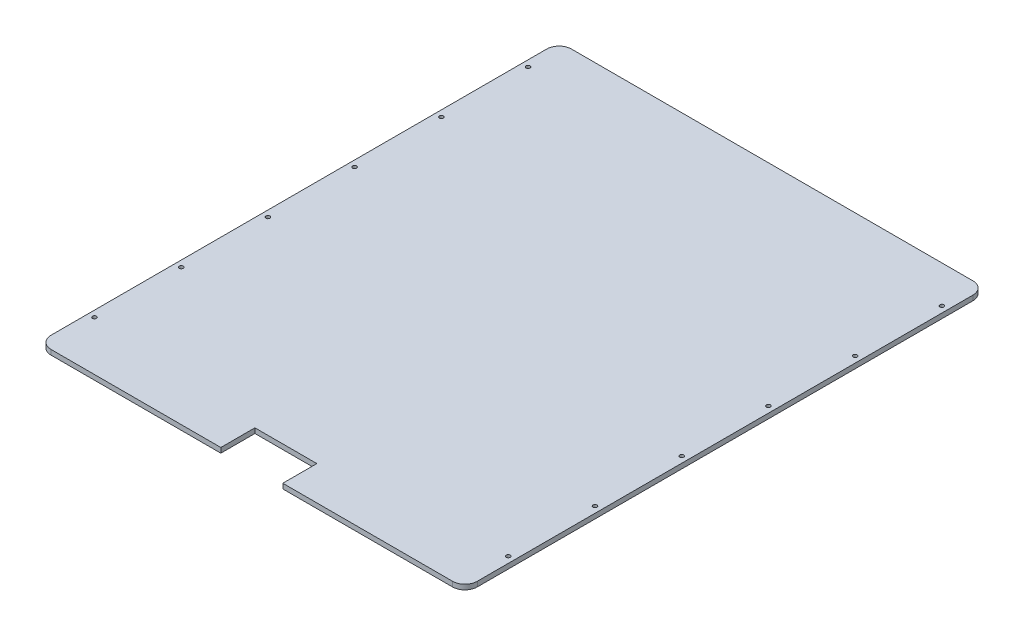
ISO-10303-21;
HEADER;
FILE_DESCRIPTION(('STEP AP214'),'2;1');
FILE_NAME('part.step','',(''),(''),'','','');
FILE_SCHEMA(('AUTOMOTIVE_DESIGN { 1 0 10303 214 1 1 1 1 }'));
ENDSEC;
DATA;
#1=APPLICATION_CONTEXT('core data for automotive mechanical design processes');
#2=APPLICATION_PROTOCOL_DEFINITION('international standard','automotive_design',2000,#1);
#3=PRODUCT_CONTEXT('',#1,'mechanical');
#4=PRODUCT('Part','Part','',(#3));
#5=PRODUCT_RELATED_PRODUCT_CATEGORY('part','',(#4));
#6=PRODUCT_DEFINITION_FORMATION('','',#4);
#7=PRODUCT_DEFINITION_CONTEXT('part definition',#1,'design');
#8=PRODUCT_DEFINITION('design','',#6,#7);
#9=PRODUCT_DEFINITION_SHAPE('','',#8);
#10=(LENGTH_UNIT() NAMED_UNIT(*) SI_UNIT(.MILLI.,.METRE.));
#11=(NAMED_UNIT(*) PLANE_ANGLE_UNIT() SI_UNIT($,.RADIAN.));
#12=(NAMED_UNIT(*) SI_UNIT($,.STERADIAN.) SOLID_ANGLE_UNIT());
#13=UNCERTAINTY_MEASURE_WITH_UNIT(LENGTH_MEASURE(1.E-05),#10,'distance_accuracy_value','');
#14=(GEOMETRIC_REPRESENTATION_CONTEXT(3) GLOBAL_UNCERTAINTY_ASSIGNED_CONTEXT((#13)) GLOBAL_UNIT_ASSIGNED_CONTEXT((#10,
#11,#12)) REPRESENTATION_CONTEXT('',''));
#15=CARTESIAN_POINT('',(0.,0.,0.));
#16=DIRECTION('',(0.,0.,1.));
#17=DIRECTION('',(1.,0.,0.));
#18=AXIS2_PLACEMENT_3D('',#15,#16,#17);
#19=CARTESIAN_POINT('',(0.,2.,0.));
#20=DIRECTION('',(0.,-1.,0.));
#21=DIRECTION('',(0.,0.,-1.));
#22=AXIS2_PLACEMENT_3D('',#19,#20,#21);
#23=PLANE('',#22);
#24=CARTESIAN_POINT('',(167.,2.,-180.));
#25=DIRECTION('',(0.,1.,0.));
#26=DIRECTION('',(0.,0.,1.));
#27=AXIS2_PLACEMENT_3D('',#24,#25,#26);
#28=CIRCLE('',#27,1.59999999999999);
#29=CARTESIAN_POINT('',(167.,2.,-178.4));
#30=VERTEX_POINT('',#29);
#31=EDGE_CURVE('E171',#30,#30,#28,.T.);
#32=ORIENTED_EDGE('',*,*,#31,.F.);
#33=EDGE_LOOP('',(#32));
#34=FACE_BOUND('',#33,.T.);
#35=CARTESIAN_POINT('',(167.,2.,-110.));
#36=DIRECTION('',(0.,1.,0.));
#37=DIRECTION('',(0.,0.,1.));
#38=AXIS2_PLACEMENT_3D('',#35,#36,#37);
#39=CIRCLE('',#38,1.59999999999999);
#40=CARTESIAN_POINT('',(167.,2.,-108.4));
#41=VERTEX_POINT('',#40);
#42=EDGE_CURVE('E177',#41,#41,#39,.T.);
#43=ORIENTED_EDGE('',*,*,#42,.F.);
#44=EDGE_LOOP('',(#43));
#45=FACE_BOUND('',#44,.T.);
#46=CARTESIAN_POINT('',(167.,2.,-40.0000000000001));
#47=DIRECTION('',(0.,1.,0.));
#48=DIRECTION('',(0.,0.,1.));
#49=AXIS2_PLACEMENT_3D('',#46,#47,#48);
#50=CIRCLE('',#49,1.59999999999999);
#51=CARTESIAN_POINT('',(167.,2.,-38.4000000000001));
#52=VERTEX_POINT('',#51);
#53=EDGE_CURVE('E183',#52,#52,#50,.T.);
#54=ORIENTED_EDGE('',*,*,#53,.F.);
#55=EDGE_LOOP('',(#54));
#56=FACE_BOUND('',#55,.T.);
#57=CARTESIAN_POINT('',(167.,2.,29.9999999999999));
#58=DIRECTION('',(0.,1.,0.));
#59=DIRECTION('',(0.,0.,1.));
#60=AXIS2_PLACEMENT_3D('',#57,#58,#59);
#61=CIRCLE('',#60,1.59999999999999);
#62=CARTESIAN_POINT('',(167.,2.,31.5999999999999));
#63=VERTEX_POINT('',#62);
#64=EDGE_CURVE('E189',#63,#63,#61,.T.);
#65=ORIENTED_EDGE('',*,*,#64,.F.);
#66=EDGE_LOOP('',(#65));
#67=FACE_BOUND('',#66,.T.);
#68=CARTESIAN_POINT('',(167.,2.,99.9999999999999));
#69=DIRECTION('',(0.,1.,0.));
#70=DIRECTION('',(0.,0.,1.));
#71=AXIS2_PLACEMENT_3D('',#68,#69,#70);
#72=CIRCLE('',#71,1.59999999999999);
#73=CARTESIAN_POINT('',(167.,2.,101.6));
#74=VERTEX_POINT('',#73);
#75=EDGE_CURVE('E195',#74,#74,#72,.T.);
#76=ORIENTED_EDGE('',*,*,#75,.F.);
#77=EDGE_LOOP('',(#76));
#78=FACE_BOUND('',#77,.T.);
#79=CARTESIAN_POINT('',(-167.,2.,-180.));
#80=DIRECTION('',(0.,1.,0.));
#81=DIRECTION('',(0.,0.,1.));
#82=AXIS2_PLACEMENT_3D('',#79,#80,#81);
#83=CIRCLE('',#82,1.59999999999999);
#84=CARTESIAN_POINT('',(-167.,2.,-178.4));
#85=VERTEX_POINT('',#84);
#86=EDGE_CURVE('E201',#85,#85,#83,.T.);
#87=ORIENTED_EDGE('',*,*,#86,.F.);
#88=EDGE_LOOP('',(#87));
#89=FACE_BOUND('',#88,.T.);
#90=CARTESIAN_POINT('',(-167.,2.,-110.));
#91=DIRECTION('',(0.,1.,0.));
#92=DIRECTION('',(0.,0.,1.));
#93=AXIS2_PLACEMENT_3D('',#90,#91,#92);
#94=CIRCLE('',#93,1.59999999999999);
#95=CARTESIAN_POINT('',(-167.,2.,-108.4));
#96=VERTEX_POINT('',#95);
#97=EDGE_CURVE('E207',#96,#96,#94,.T.);
#98=ORIENTED_EDGE('',*,*,#97,.F.);
#99=EDGE_LOOP('',(#98));
#100=FACE_BOUND('',#99,.T.);
#101=CARTESIAN_POINT('',(-167.,2.,-40.));
#102=DIRECTION('',(0.,1.,0.));
#103=DIRECTION('',(0.,0.,1.));
#104=AXIS2_PLACEMENT_3D('',#101,#102,#103);
#105=CIRCLE('',#104,1.59999999999999);
#106=CARTESIAN_POINT('',(-167.,2.,-38.4));
#107=VERTEX_POINT('',#106);
#108=EDGE_CURVE('E213',#107,#107,#105,.T.);
#109=ORIENTED_EDGE('',*,*,#108,.F.);
#110=EDGE_LOOP('',(#109));
#111=FACE_BOUND('',#110,.T.);
#112=CARTESIAN_POINT('',(-167.,2.,30.));
#113=DIRECTION('',(0.,1.,0.));
#114=DIRECTION('',(0.,0.,1.));
#115=AXIS2_PLACEMENT_3D('',#112,#113,#114);
#116=CIRCLE('',#115,1.59999999999999);
#117=CARTESIAN_POINT('',(-167.,2.,31.6));
#118=VERTEX_POINT('',#117);
#119=EDGE_CURVE('E219',#118,#118,#116,.T.);
#120=ORIENTED_EDGE('',*,*,#119,.F.);
#121=EDGE_LOOP('',(#120));
#122=FACE_BOUND('',#121,.T.);
#123=CARTESIAN_POINT('',(-167.,2.,100.));
#124=DIRECTION('',(0.,1.,0.));
#125=DIRECTION('',(0.,0.,1.));
#126=AXIS2_PLACEMENT_3D('',#123,#124,#125);
#127=CIRCLE('',#126,1.59999999999999);
#128=CARTESIAN_POINT('',(-167.,2.,101.6));
#129=VERTEX_POINT('',#128);
#130=EDGE_CURVE('E225',#129,#129,#127,.T.);
#131=ORIENTED_EDGE('',*,*,#130,.F.);
#132=EDGE_LOOP('',(#131));
#133=FACE_BOUND('',#132,.T.);
#134=CARTESIAN_POINT('',(167.,2.,170.));
#135=DIRECTION('',(0.,1.,0.));
#136=DIRECTION('',(0.,0.,1.));
#137=AXIS2_PLACEMENT_3D('',#134,#135,#136);
#138=CIRCLE('',#137,1.59999999999999);
#139=CARTESIAN_POINT('',(167.,2.,171.6));
#140=VERTEX_POINT('',#139);
#141=EDGE_CURVE('E231',#140,#140,#138,.T.);
#142=ORIENTED_EDGE('',*,*,#141,.F.);
#143=EDGE_LOOP('',(#142));
#144=FACE_BOUND('',#143,.T.);
#145=CARTESIAN_POINT('',(-167.,2.,170.));
#146=DIRECTION('',(0.,1.,0.));
#147=DIRECTION('',(0.,0.,1.));
#148=AXIS2_PLACEMENT_3D('',#145,#146,#147);
#149=CIRCLE('',#148,1.59999999999999);
#150=CARTESIAN_POINT('',(-167.,2.,171.6));
#151=VERTEX_POINT('',#150);
#152=EDGE_CURVE('E237',#151,#151,#149,.T.);
#153=ORIENTED_EDGE('',*,*,#152,.F.);
#154=EDGE_LOOP('',(#153));
#155=FACE_BOUND('',#154,.T.);
#156=DIRECTION('',(1.,0.,0.));
#157=VECTOR('',#156,1.);
#158=CARTESIAN_POINT('',(172.,2.,210.));
#159=LINE('',#158,#157);
#160=CARTESIAN_POINT('',(25.,2.,210.));
#161=VERTEX_POINT('',#160);
#162=CARTESIAN_POINT('',(162.,2.,210.));
#163=VERTEX_POINT('',#162);
#164=EDGE_CURVE('E245',#161,#163,#159,.T.);
#165=ORIENTED_EDGE('',*,*,#164,.T.);
#166=CARTESIAN_POINT('',(162.,2.,200.));
#167=DIRECTION('',(0.,-1.,0.));
#168=DIRECTION('',(0.,0.,-1.));
#169=AXIS2_PLACEMENT_3D('',#166,#167,#168);
#170=CIRCLE('',#169,10.);
#171=CARTESIAN_POINT('',(172.,2.,200.));
#172=VERTEX_POINT('',#171);
#173=EDGE_CURVE('E280',#163,#172,#170,.F.);
#174=ORIENTED_EDGE('',*,*,#173,.T.);
#175=DIRECTION('',(0.,0.,-1.));
#176=VECTOR('',#175,1.);
#177=CARTESIAN_POINT('',(172.,2.,-210.));
#178=LINE('',#177,#176);
#179=CARTESIAN_POINT('',(172.,2.,-200.));
#180=VERTEX_POINT('',#179);
#181=EDGE_CURVE('E249',#172,#180,#178,.T.);
#182=ORIENTED_EDGE('',*,*,#181,.T.);
#183=CARTESIAN_POINT('',(162.,2.,-200.));
#184=DIRECTION('',(0.,-1.,0.));
#185=DIRECTION('',(0.,0.,-1.));
#186=AXIS2_PLACEMENT_3D('',#183,#184,#185);
#187=CIRCLE('',#186,10.);
#188=CARTESIAN_POINT('',(162.,2.,-210.));
#189=VERTEX_POINT('',#188);
#190=EDGE_CURVE('E277',#180,#189,#187,.F.);
#191=ORIENTED_EDGE('',*,*,#190,.T.);
#192=DIRECTION('',(-1.,0.,0.));
#193=VECTOR('',#192,1.);
#194=CARTESIAN_POINT('',(172.,2.,-210.));
#195=LINE('',#194,#193);
#196=CARTESIAN_POINT('',(-162.,2.,-210.));
#197=VERTEX_POINT('',#196);
#198=EDGE_CURVE('E252',#189,#197,#195,.T.);
#199=ORIENTED_EDGE('',*,*,#198,.T.);
#200=CARTESIAN_POINT('',(-162.,2.,-200.));
#201=DIRECTION('',(0.,-1.,0.));
#202=DIRECTION('',(0.,0.,-1.));
#203=AXIS2_PLACEMENT_3D('',#200,#201,#202);
#204=CIRCLE('',#203,10.);
#205=CARTESIAN_POINT('',(-172.,2.,-200.));
#206=VERTEX_POINT('',#205);
#207=EDGE_CURVE('E275',#197,#206,#204,.F.);
#208=ORIENTED_EDGE('',*,*,#207,.T.);
#209=DIRECTION('',(0.,0.,1.));
#210=VECTOR('',#209,1.);
#211=CARTESIAN_POINT('',(-172.,2.,-210.));
#212=LINE('',#211,#210);
#213=CARTESIAN_POINT('',(-172.,2.,200.));
#214=VERTEX_POINT('',#213);
#215=EDGE_CURVE('E243',#206,#214,#212,.T.);
#216=ORIENTED_EDGE('',*,*,#215,.T.);
#217=CARTESIAN_POINT('',(-162.,2.,200.));
#218=DIRECTION('',(0.,-1.,0.));
#219=DIRECTION('',(0.,0.,-1.));
#220=AXIS2_PLACEMENT_3D('',#217,#218,#219);
#221=CIRCLE('',#220,10.);
#222=CARTESIAN_POINT('',(-162.,2.,210.));
#223=VERTEX_POINT('',#222);
#224=EDGE_CURVE('E50',#214,#223,#221,.F.);
#225=ORIENTED_EDGE('',*,*,#224,.T.);
#226=CARTESIAN_POINT('',(-25.,2.,210.));
#227=VERTEX_POINT('',#226);
#228=EDGE_CURVE('E247',#223,#227,#159,.T.);
#229=ORIENTED_EDGE('',*,*,#228,.T.);
#230=DIRECTION('',(0.,0.,1.));
#231=VECTOR('',#230,1.);
#232=CARTESIAN_POINT('',(-25.0000000000001,2.,182.5));
#233=LINE('',#232,#231);
#234=CARTESIAN_POINT('',(-25.0000000000001,2.,182.5));
#235=VERTEX_POINT('',#234);
#236=EDGE_CURVE('E146',#235,#227,#233,.T.);
#237=ORIENTED_EDGE('',*,*,#236,.F.);
#238=DIRECTION('',(-1.,0.,0.));
#239=VECTOR('',#238,1.);
#240=CARTESIAN_POINT('',(25.,2.,182.5));
#241=LINE('',#240,#239);
#242=CARTESIAN_POINT('',(25.,2.,182.5));
#243=VERTEX_POINT('',#242);
#244=EDGE_CURVE('E163',#243,#235,#241,.T.);
#245=ORIENTED_EDGE('',*,*,#244,.F.);
#246=DIRECTION('',(0.,0.,-1.));
#247=VECTOR('',#246,1.);
#248=CARTESIAN_POINT('',(25.,2.,182.5));
#249=LINE('',#248,#247);
#250=EDGE_CURVE('E161',#161,#243,#249,.T.);
#251=ORIENTED_EDGE('',*,*,#250,.F.);
#252=EDGE_LOOP('',(#165,#174,#182,#191,#199,#208,#216,#225,#229,#237,#245,#251));
#253=FACE_BOUND('',#252,.T.);
#254=ADVANCED_FACE('F35',(#34,#45,#56,#67,#78,#89,#100,#111,#122,#133,#144,#155,#253),#23,.F.);
#255=CARTESIAN_POINT('',(0.,-2.,0.));
#256=DIRECTION('',(0.,-1.,0.));
#257=DIRECTION('',(0.,0.,-1.));
#258=AXIS2_PLACEMENT_3D('',#255,#256,#257);
#259=PLANE('',#258);
#260=CARTESIAN_POINT('',(167.,-2.,-110.));
#261=DIRECTION('',(0.,1.,0.));
#262=DIRECTION('',(0.,0.,1.));
#263=AXIS2_PLACEMENT_3D('',#260,#261,#262);
#264=CIRCLE('',#263,1.59999999999999);
#265=CARTESIAN_POINT('',(167.,-2.,-108.4));
#266=VERTEX_POINT('',#265);
#267=EDGE_CURVE('E174',#266,#266,#264,.T.);
#268=ORIENTED_EDGE('',*,*,#267,.T.);
#269=EDGE_LOOP('',(#268));
#270=FACE_BOUND('',#269,.T.);
#271=CARTESIAN_POINT('',(167.,-2.,29.9999999999999));
#272=DIRECTION('',(0.,1.,0.));
#273=DIRECTION('',(0.,0.,1.));
#274=AXIS2_PLACEMENT_3D('',#271,#272,#273);
#275=CIRCLE('',#274,1.59999999999999);
#276=CARTESIAN_POINT('',(167.,-2.,31.5999999999999));
#277=VERTEX_POINT('',#276);
#278=EDGE_CURVE('E186',#277,#277,#275,.T.);
#279=ORIENTED_EDGE('',*,*,#278,.T.);
#280=EDGE_LOOP('',(#279));
#281=FACE_BOUND('',#280,.T.);
#282=CARTESIAN_POINT('',(-167.,-2.,-180.));
#283=DIRECTION('',(0.,1.,0.));
#284=DIRECTION('',(0.,0.,1.));
#285=AXIS2_PLACEMENT_3D('',#282,#283,#284);
#286=CIRCLE('',#285,1.59999999999999);
#287=CARTESIAN_POINT('',(-167.,-2.,-178.4));
#288=VERTEX_POINT('',#287);
#289=EDGE_CURVE('E198',#288,#288,#286,.T.);
#290=ORIENTED_EDGE('',*,*,#289,.T.);
#291=EDGE_LOOP('',(#290));
#292=FACE_BOUND('',#291,.T.);
#293=CARTESIAN_POINT('',(-167.,-2.,-40.));
#294=DIRECTION('',(0.,1.,0.));
#295=DIRECTION('',(0.,0.,1.));
#296=AXIS2_PLACEMENT_3D('',#293,#294,#295);
#297=CIRCLE('',#296,1.59999999999999);
#298=CARTESIAN_POINT('',(-167.,-2.,-38.4));
#299=VERTEX_POINT('',#298);
#300=EDGE_CURVE('E210',#299,#299,#297,.T.);
#301=ORIENTED_EDGE('',*,*,#300,.T.);
#302=EDGE_LOOP('',(#301));
#303=FACE_BOUND('',#302,.T.);
#304=CARTESIAN_POINT('',(-167.,-2.,100.));
#305=DIRECTION('',(0.,1.,0.));
#306=DIRECTION('',(0.,0.,1.));
#307=AXIS2_PLACEMENT_3D('',#304,#305,#306);
#308=CIRCLE('',#307,1.59999999999999);
#309=CARTESIAN_POINT('',(-167.,-2.,101.6));
#310=VERTEX_POINT('',#309);
#311=EDGE_CURVE('E222',#310,#310,#308,.T.);
#312=ORIENTED_EDGE('',*,*,#311,.T.);
#313=EDGE_LOOP('',(#312));
#314=FACE_BOUND('',#313,.T.);
#315=CARTESIAN_POINT('',(-167.,-2.,170.));
#316=DIRECTION('',(0.,1.,0.));
#317=DIRECTION('',(0.,0.,1.));
#318=AXIS2_PLACEMENT_3D('',#315,#316,#317);
#319=CIRCLE('',#318,1.59999999999999);
#320=CARTESIAN_POINT('',(-167.,-2.,171.6));
#321=VERTEX_POINT('',#320);
#322=EDGE_CURVE('E234',#321,#321,#319,.T.);
#323=ORIENTED_EDGE('',*,*,#322,.T.);
#324=EDGE_LOOP('',(#323));
#325=FACE_BOUND('',#324,.T.);
#326=CARTESIAN_POINT('',(167.,-2.,170.));
#327=DIRECTION('',(0.,1.,0.));
#328=DIRECTION('',(0.,0.,1.));
#329=AXIS2_PLACEMENT_3D('',#326,#327,#328);
#330=CIRCLE('',#329,1.59999999999999);
#331=CARTESIAN_POINT('',(167.,-2.,171.6));
#332=VERTEX_POINT('',#331);
#333=EDGE_CURVE('E228',#332,#332,#330,.T.);
#334=ORIENTED_EDGE('',*,*,#333,.T.);
#335=EDGE_LOOP('',(#334));
#336=FACE_BOUND('',#335,.T.);
#337=CARTESIAN_POINT('',(-167.,-2.,30.));
#338=DIRECTION('',(0.,1.,0.));
#339=DIRECTION('',(0.,0.,1.));
#340=AXIS2_PLACEMENT_3D('',#337,#338,#339);
#341=CIRCLE('',#340,1.59999999999999);
#342=CARTESIAN_POINT('',(-167.,-2.,31.6));
#343=VERTEX_POINT('',#342);
#344=EDGE_CURVE('E216',#343,#343,#341,.T.);
#345=ORIENTED_EDGE('',*,*,#344,.T.);
#346=EDGE_LOOP('',(#345));
#347=FACE_BOUND('',#346,.T.);
#348=CARTESIAN_POINT('',(-167.,-2.,-110.));
#349=DIRECTION('',(0.,1.,0.));
#350=DIRECTION('',(0.,0.,1.));
#351=AXIS2_PLACEMENT_3D('',#348,#349,#350);
#352=CIRCLE('',#351,1.59999999999999);
#353=CARTESIAN_POINT('',(-167.,-2.,-108.4));
#354=VERTEX_POINT('',#353);
#355=EDGE_CURVE('E204',#354,#354,#352,.T.);
#356=ORIENTED_EDGE('',*,*,#355,.T.);
#357=EDGE_LOOP('',(#356));
#358=FACE_BOUND('',#357,.T.);
#359=CARTESIAN_POINT('',(167.,-2.,99.9999999999999));
#360=DIRECTION('',(0.,1.,0.));
#361=DIRECTION('',(0.,0.,1.));
#362=AXIS2_PLACEMENT_3D('',#359,#360,#361);
#363=CIRCLE('',#362,1.59999999999999);
#364=CARTESIAN_POINT('',(167.,-2.,101.6));
#365=VERTEX_POINT('',#364);
#366=EDGE_CURVE('E192',#365,#365,#363,.T.);
#367=ORIENTED_EDGE('',*,*,#366,.T.);
#368=EDGE_LOOP('',(#367));
#369=FACE_BOUND('',#368,.T.);
#370=CARTESIAN_POINT('',(167.,-2.,-40.0000000000001));
#371=DIRECTION('',(0.,1.,0.));
#372=DIRECTION('',(0.,0.,1.));
#373=AXIS2_PLACEMENT_3D('',#370,#371,#372);
#374=CIRCLE('',#373,1.59999999999999);
#375=CARTESIAN_POINT('',(167.,-2.,-38.4000000000001));
#376=VERTEX_POINT('',#375);
#377=EDGE_CURVE('E180',#376,#376,#374,.T.);
#378=ORIENTED_EDGE('',*,*,#377,.T.);
#379=EDGE_LOOP('',(#378));
#380=FACE_BOUND('',#379,.T.);
#381=CARTESIAN_POINT('',(167.,-2.,-180.));
#382=DIRECTION('',(0.,1.,0.));
#383=DIRECTION('',(0.,0.,1.));
#384=AXIS2_PLACEMENT_3D('',#381,#382,#383);
#385=CIRCLE('',#384,1.59999999999999);
#386=CARTESIAN_POINT('',(167.,-2.,-178.4));
#387=VERTEX_POINT('',#386);
#388=EDGE_CURVE('E147',#387,#387,#385,.T.);
#389=ORIENTED_EDGE('',*,*,#388,.T.);
#390=EDGE_LOOP('',(#389));
#391=FACE_BOUND('',#390,.T.);
#392=DIRECTION('',(0.,0.,-1.));
#393=VECTOR('',#392,1.);
#394=CARTESIAN_POINT('',(172.,-2.,-210.));
#395=LINE('',#394,#393);
#396=CARTESIAN_POINT('',(172.,-2.,200.));
#397=VERTEX_POINT('',#396);
#398=CARTESIAN_POINT('',(172.,-2.,-200.));
#399=VERTEX_POINT('',#398);
#400=EDGE_CURVE('E135',#397,#399,#395,.T.);
#401=ORIENTED_EDGE('',*,*,#400,.F.);
#402=CARTESIAN_POINT('',(162.,-2.,200.));
#403=DIRECTION('',(0.,-1.,0.));
#404=DIRECTION('',(0.,0.,-1.));
#405=AXIS2_PLACEMENT_3D('',#402,#403,#404);
#406=CIRCLE('',#405,10.);
#407=CARTESIAN_POINT('',(162.,-2.,210.));
#408=VERTEX_POINT('',#407);
#409=EDGE_CURVE('E271',#397,#408,#406,.T.);
#410=ORIENTED_EDGE('',*,*,#409,.T.);
#411=DIRECTION('',(1.,0.,0.));
#412=VECTOR('',#411,1.);
#413=CARTESIAN_POINT('',(172.,-2.,210.));
#414=LINE('',#413,#412);
#415=CARTESIAN_POINT('',(24.9999999999999,-2.,210.));
#416=VERTEX_POINT('',#415);
#417=EDGE_CURVE('E136',#416,#408,#414,.T.);
#418=ORIENTED_EDGE('',*,*,#417,.F.);
#419=DIRECTION('',(0.,0.,-1.));
#420=VECTOR('',#419,1.);
#421=CARTESIAN_POINT('',(25.,-2.,182.5));
#422=LINE('',#421,#420);
#423=CARTESIAN_POINT('',(25.,-2.,182.5));
#424=VERTEX_POINT('',#423);
#425=EDGE_CURVE('E155',#416,#424,#422,.T.);
#426=ORIENTED_EDGE('',*,*,#425,.T.);
#427=DIRECTION('',(-1.,0.,0.));
#428=VECTOR('',#427,1.);
#429=CARTESIAN_POINT('',(25.,-2.,182.5));
#430=LINE('',#429,#428);
#431=CARTESIAN_POINT('',(-25.0000000000001,-2.,182.5));
#432=VERTEX_POINT('',#431);
#433=EDGE_CURVE('E154',#424,#432,#430,.T.);
#434=ORIENTED_EDGE('',*,*,#433,.T.);
#435=DIRECTION('',(0.,0.,1.));
#436=VECTOR('',#435,1.);
#437=CARTESIAN_POINT('',(-25.0000000000001,-2.,182.5));
#438=LINE('',#437,#436);
#439=CARTESIAN_POINT('',(-25.,-2.,210.));
#440=VERTEX_POINT('',#439);
#441=EDGE_CURVE('E143',#432,#440,#438,.T.);
#442=ORIENTED_EDGE('',*,*,#441,.T.);
#443=CARTESIAN_POINT('',(-162.,-2.,210.));
#444=VERTEX_POINT('',#443);
#445=EDGE_CURVE('E127',#444,#440,#414,.T.);
#446=ORIENTED_EDGE('',*,*,#445,.F.);
#447=CARTESIAN_POINT('',(-162.,-2.,200.));
#448=DIRECTION('',(0.,-1.,0.));
#449=DIRECTION('',(0.,0.,-1.));
#450=AXIS2_PLACEMENT_3D('',#447,#448,#449);
#451=CIRCLE('',#450,10.);
#452=CARTESIAN_POINT('',(-172.,-2.,200.));
#453=VERTEX_POINT('',#452);
#454=EDGE_CURVE('E269',#444,#453,#451,.T.);
#455=ORIENTED_EDGE('',*,*,#454,.T.);
#456=DIRECTION('',(0.,0.,1.));
#457=VECTOR('',#456,1.);
#458=CARTESIAN_POINT('',(-172.,-2.,-210.));
#459=LINE('',#458,#457);
#460=CARTESIAN_POINT('',(-172.,-2.,-200.));
#461=VERTEX_POINT('',#460);
#462=EDGE_CURVE('E240',#461,#453,#459,.T.);
#463=ORIENTED_EDGE('',*,*,#462,.F.);
#464=CARTESIAN_POINT('',(-162.,-2.,-200.));
#465=DIRECTION('',(0.,-1.,0.));
#466=DIRECTION('',(0.,0.,-1.));
#467=AXIS2_PLACEMENT_3D('',#464,#465,#466);
#468=CIRCLE('',#467,10.);
#469=CARTESIAN_POINT('',(-162.,-2.,-210.));
#470=VERTEX_POINT('',#469);
#471=EDGE_CURVE('E265',#461,#470,#468,.T.);
#472=ORIENTED_EDGE('',*,*,#471,.T.);
#473=DIRECTION('',(-1.,0.,0.));
#474=VECTOR('',#473,1.);
#475=CARTESIAN_POINT('',(172.,-2.,-210.));
#476=LINE('',#475,#474);
#477=CARTESIAN_POINT('',(162.,-2.,-210.));
#478=VERTEX_POINT('',#477);
#479=EDGE_CURVE('E246',#478,#470,#476,.T.);
#480=ORIENTED_EDGE('',*,*,#479,.F.);
#481=CARTESIAN_POINT('',(162.,-2.,-200.));
#482=DIRECTION('',(0.,-1.,0.));
#483=DIRECTION('',(0.,0.,-1.));
#484=AXIS2_PLACEMENT_3D('',#481,#482,#483);
#485=CIRCLE('',#484,10.);
#486=EDGE_CURVE('E267',#478,#399,#485,.T.);
#487=ORIENTED_EDGE('',*,*,#486,.T.);
#488=EDGE_LOOP('',(#401,#410,#418,#426,#434,#442,#446,#455,#463,#472,#480,#487));
#489=FACE_BOUND('',#488,.T.);
#490=ADVANCED_FACE('F151',(#270,#281,#292,#303,#314,#325,#336,#347,#358,#369,#380,#391,#489),
#259,.T.);
#491=CARTESIAN_POINT('',(172.,2.,210.));
#492=DIRECTION('',(0.,0.,-1.));
#493=DIRECTION('',(-1.,0.,0.));
#494=AXIS2_PLACEMENT_3D('',#491,#492,#493);
#495=PLANE('',#494);
#496=ORIENTED_EDGE('',*,*,#228,.F.);
#497=DIRECTION('',(0.,-1.,0.));
#498=VECTOR('',#497,1.);
#499=CARTESIAN_POINT('',(-162.,2.,210.));
#500=LINE('',#499,#498);
#501=EDGE_CURVE('E132',#223,#444,#500,.T.);
#502=ORIENTED_EDGE('',*,*,#501,.T.);
#503=ORIENTED_EDGE('',*,*,#445,.T.);
#504=DIRECTION('',(0.,-1.,0.));
#505=VECTOR('',#504,1.);
#506=CARTESIAN_POINT('',(-25.,2.,210.));
#507=LINE('',#506,#505);
#508=EDGE_CURVE('E130',#227,#440,#507,.T.);
#509=ORIENTED_EDGE('',*,*,#508,.F.);
#510=EDGE_LOOP('',(#496,#502,#503,#509));
#511=FACE_BOUND('',#510,.T.);
#512=ADVANCED_FACE('F129',(#511),#495,.F.);
#513=ORIENTED_EDGE('',*,*,#417,.T.);
#514=DIRECTION('',(0.,-1.,0.));
#515=VECTOR('',#514,1.);
#516=CARTESIAN_POINT('',(162.,2.,210.));
#517=LINE('',#516,#515);
#518=EDGE_CURVE('E273',#408,#163,#517,.F.);
#519=ORIENTED_EDGE('',*,*,#518,.T.);
#520=ORIENTED_EDGE('',*,*,#164,.F.);
#521=DIRECTION('',(0.,-1.,0.));
#522=VECTOR('',#521,1.);
#523=CARTESIAN_POINT('',(25.,2.,210.));
#524=LINE('',#523,#522);
#525=EDGE_CURVE('E148',#161,#416,#524,.T.);
#526=ORIENTED_EDGE('',*,*,#525,.T.);
#527=EDGE_LOOP('',(#513,#519,#520,#526));
#528=FACE_BOUND('',#527,.T.);
#529=ADVANCED_FACE('F336',(#528),#495,.F.);
#530=CARTESIAN_POINT('',(-172.,2.,-210.));
#531=DIRECTION('',(1.,0.,0.));
#532=DIRECTION('',(0.,0.,-1.));
#533=AXIS2_PLACEMENT_3D('',#530,#531,#532);
#534=PLANE('',#533);
#535=ORIENTED_EDGE('',*,*,#462,.T.);
#536=DIRECTION('',(0.,-1.,0.));
#537=VECTOR('',#536,1.);
#538=CARTESIAN_POINT('',(-172.,2.,200.));
#539=LINE('',#538,#537);
#540=EDGE_CURVE('E58',#453,#214,#539,.F.);
#541=ORIENTED_EDGE('',*,*,#540,.T.);
#542=ORIENTED_EDGE('',*,*,#215,.F.);
#543=DIRECTION('',(0.,-1.,0.));
#544=VECTOR('',#543,1.);
#545=CARTESIAN_POINT('',(-172.,2.,-200.));
#546=LINE('',#545,#544);
#547=EDGE_CURVE('E283',#206,#461,#546,.T.);
#548=ORIENTED_EDGE('',*,*,#547,.T.);
#549=EDGE_LOOP('',(#535,#541,#542,#548));
#550=FACE_BOUND('',#549,.T.);
#551=ADVANCED_FACE('F298',(#550),#534,.F.);
#552=CARTESIAN_POINT('',(172.,2.,-210.));
#553=DIRECTION('',(-1.,0.,0.));
#554=DIRECTION('',(0.,0.,1.));
#555=AXIS2_PLACEMENT_3D('',#552,#553,#554);
#556=PLANE('',#555);
#557=ORIENTED_EDGE('',*,*,#181,.F.);
#558=DIRECTION('',(0.,-1.,0.));
#559=VECTOR('',#558,1.);
#560=CARTESIAN_POINT('',(172.,2.,200.));
#561=LINE('',#560,#559);
#562=EDGE_CURVE('E262',#172,#397,#561,.T.);
#563=ORIENTED_EDGE('',*,*,#562,.T.);
#564=ORIENTED_EDGE('',*,*,#400,.T.);
#565=DIRECTION('',(0.,-1.,0.));
#566=VECTOR('',#565,1.);
#567=CARTESIAN_POINT('',(172.,2.,-200.));
#568=LINE('',#567,#566);
#569=EDGE_CURVE('E255',#399,#180,#568,.F.);
#570=ORIENTED_EDGE('',*,*,#569,.T.);
#571=EDGE_LOOP('',(#557,#563,#564,#570));
#572=FACE_BOUND('',#571,.T.);
#573=ADVANCED_FACE('F330',(#572),#556,.F.);
#574=CARTESIAN_POINT('',(172.,2.,-210.));
#575=DIRECTION('',(0.,0.,1.));
#576=DIRECTION('',(1.,0.,0.));
#577=AXIS2_PLACEMENT_3D('',#574,#575,#576);
#578=PLANE('',#577);
#579=ORIENTED_EDGE('',*,*,#198,.F.);
#580=DIRECTION('',(0.,-1.,0.));
#581=VECTOR('',#580,1.);
#582=CARTESIAN_POINT('',(162.,2.,-210.));
#583=LINE('',#582,#581);
#584=EDGE_CURVE('E11',#189,#478,#583,.T.);
#585=ORIENTED_EDGE('',*,*,#584,.T.);
#586=ORIENTED_EDGE('',*,*,#479,.T.);
#587=DIRECTION('',(0.,-1.,0.));
#588=VECTOR('',#587,1.);
#589=CARTESIAN_POINT('',(-162.,2.,-210.));
#590=LINE('',#589,#588);
#591=EDGE_CURVE('E43',#470,#197,#590,.F.);
#592=ORIENTED_EDGE('',*,*,#591,.T.);
#593=EDGE_LOOP('',(#579,#585,#586,#592));
#594=FACE_BOUND('',#593,.T.);
#595=ADVANCED_FACE('F289',(#594),#578,.F.);
#596=CARTESIAN_POINT('',(-167.,2.,170.));
#597=DIRECTION('',(0.,-1.,0.));
#598=DIRECTION('',(0.,0.,-1.));
#599=AXIS2_PLACEMENT_3D('',#596,#597,#598);
#600=CYLINDRICAL_SURFACE('',#599,1.59999999999999);
#601=ORIENTED_EDGE('',*,*,#152,.T.);
#602=EDGE_LOOP('',(#601));
#603=FACE_BOUND('',#602,.T.);
#604=ORIENTED_EDGE('',*,*,#322,.F.);
#605=EDGE_LOOP('',(#604));
#606=FACE_BOUND('',#605,.T.);
#607=ADVANCED_FACE('F325',(#603,#606),#600,.F.);
#608=CARTESIAN_POINT('',(167.,2.,170.));
#609=DIRECTION('',(0.,-1.,0.));
#610=DIRECTION('',(0.,0.,-1.));
#611=AXIS2_PLACEMENT_3D('',#608,#609,#610);
#612=CYLINDRICAL_SURFACE('',#611,1.59999999999999);
#613=ORIENTED_EDGE('',*,*,#141,.T.);
#614=EDGE_LOOP('',(#613));
#615=FACE_BOUND('',#614,.T.);
#616=ORIENTED_EDGE('',*,*,#333,.F.);
#617=EDGE_LOOP('',(#616));
#618=FACE_BOUND('',#617,.T.);
#619=ADVANCED_FACE('F404',(#615,#618),#612,.F.);
#620=CARTESIAN_POINT('',(-167.,2.,100.));
#621=DIRECTION('',(0.,-1.,0.));
#622=DIRECTION('',(0.,0.,-1.));
#623=AXIS2_PLACEMENT_3D('',#620,#621,#622);
#624=CYLINDRICAL_SURFACE('',#623,1.59999999999999);
#625=ORIENTED_EDGE('',*,*,#130,.T.);
#626=EDGE_LOOP('',(#625));
#627=FACE_BOUND('',#626,.T.);
#628=ORIENTED_EDGE('',*,*,#311,.F.);
#629=EDGE_LOOP('',(#628));
#630=FACE_BOUND('',#629,.T.);
#631=ADVANCED_FACE('F401',(#627,#630),#624,.F.);
#632=CARTESIAN_POINT('',(-167.,2.,30.));
#633=DIRECTION('',(0.,-1.,0.));
#634=DIRECTION('',(0.,0.,-1.));
#635=AXIS2_PLACEMENT_3D('',#632,#633,#634);
#636=CYLINDRICAL_SURFACE('',#635,1.59999999999999);
#637=ORIENTED_EDGE('',*,*,#119,.T.);
#638=EDGE_LOOP('',(#637));
#639=FACE_BOUND('',#638,.T.);
#640=ORIENTED_EDGE('',*,*,#344,.F.);
#641=EDGE_LOOP('',(#640));
#642=FACE_BOUND('',#641,.T.);
#643=ADVANCED_FACE('F397',(#639,#642),#636,.F.);
#644=CARTESIAN_POINT('',(-167.,2.,-40.));
#645=DIRECTION('',(0.,-1.,0.));
#646=DIRECTION('',(0.,0.,-1.));
#647=AXIS2_PLACEMENT_3D('',#644,#645,#646);
#648=CYLINDRICAL_SURFACE('',#647,1.59999999999999);
#649=ORIENTED_EDGE('',*,*,#108,.T.);
#650=EDGE_LOOP('',(#649));
#651=FACE_BOUND('',#650,.T.);
#652=ORIENTED_EDGE('',*,*,#300,.F.);
#653=EDGE_LOOP('',(#652));
#654=FACE_BOUND('',#653,.T.);
#655=ADVANCED_FACE('F393',(#651,#654),#648,.F.);
#656=CARTESIAN_POINT('',(-167.,2.,-110.));
#657=DIRECTION('',(0.,-1.,0.));
#658=DIRECTION('',(0.,0.,-1.));
#659=AXIS2_PLACEMENT_3D('',#656,#657,#658);
#660=CYLINDRICAL_SURFACE('',#659,1.59999999999999);
#661=ORIENTED_EDGE('',*,*,#97,.T.);
#662=EDGE_LOOP('',(#661));
#663=FACE_BOUND('',#662,.T.);
#664=ORIENTED_EDGE('',*,*,#355,.F.);
#665=EDGE_LOOP('',(#664));
#666=FACE_BOUND('',#665,.T.);
#667=ADVANCED_FACE('F389',(#663,#666),#660,.F.);
#668=CARTESIAN_POINT('',(-167.,2.,-180.));
#669=DIRECTION('',(0.,-1.,0.));
#670=DIRECTION('',(0.,0.,-1.));
#671=AXIS2_PLACEMENT_3D('',#668,#669,#670);
#672=CYLINDRICAL_SURFACE('',#671,1.59999999999999);
#673=ORIENTED_EDGE('',*,*,#86,.T.);
#674=EDGE_LOOP('',(#673));
#675=FACE_BOUND('',#674,.T.);
#676=ORIENTED_EDGE('',*,*,#289,.F.);
#677=EDGE_LOOP('',(#676));
#678=FACE_BOUND('',#677,.T.);
#679=ADVANCED_FACE('F385',(#675,#678),#672,.F.);
#680=CARTESIAN_POINT('',(167.,2.,99.9999999999999));
#681=DIRECTION('',(0.,-1.,0.));
#682=DIRECTION('',(0.,0.,-1.));
#683=AXIS2_PLACEMENT_3D('',#680,#681,#682);
#684=CYLINDRICAL_SURFACE('',#683,1.59999999999999);
#685=ORIENTED_EDGE('',*,*,#75,.T.);
#686=EDGE_LOOP('',(#685));
#687=FACE_BOUND('',#686,.T.);
#688=ORIENTED_EDGE('',*,*,#366,.F.);
#689=EDGE_LOOP('',(#688));
#690=FACE_BOUND('',#689,.T.);
#691=ADVANCED_FACE('F381',(#687,#690),#684,.F.);
#692=CARTESIAN_POINT('',(167.,2.,29.9999999999999));
#693=DIRECTION('',(0.,-1.,0.));
#694=DIRECTION('',(0.,0.,-1.));
#695=AXIS2_PLACEMENT_3D('',#692,#693,#694);
#696=CYLINDRICAL_SURFACE('',#695,1.59999999999999);
#697=ORIENTED_EDGE('',*,*,#64,.T.);
#698=EDGE_LOOP('',(#697));
#699=FACE_BOUND('',#698,.T.);
#700=ORIENTED_EDGE('',*,*,#278,.F.);
#701=EDGE_LOOP('',(#700));
#702=FACE_BOUND('',#701,.T.);
#703=ADVANCED_FACE('F377',(#699,#702),#696,.F.);
#704=CARTESIAN_POINT('',(167.,2.,-40.0000000000001));
#705=DIRECTION('',(0.,-1.,0.));
#706=DIRECTION('',(0.,0.,-1.));
#707=AXIS2_PLACEMENT_3D('',#704,#705,#706);
#708=CYLINDRICAL_SURFACE('',#707,1.59999999999999);
#709=ORIENTED_EDGE('',*,*,#53,.T.);
#710=EDGE_LOOP('',(#709));
#711=FACE_BOUND('',#710,.T.);
#712=ORIENTED_EDGE('',*,*,#377,.F.);
#713=EDGE_LOOP('',(#712));
#714=FACE_BOUND('',#713,.T.);
#715=ADVANCED_FACE('F373',(#711,#714),#708,.F.);
#716=CARTESIAN_POINT('',(167.,2.,-110.));
#717=DIRECTION('',(0.,-1.,0.));
#718=DIRECTION('',(0.,0.,-1.));
#719=AXIS2_PLACEMENT_3D('',#716,#717,#718);
#720=CYLINDRICAL_SURFACE('',#719,1.59999999999999);
#721=ORIENTED_EDGE('',*,*,#42,.T.);
#722=EDGE_LOOP('',(#721));
#723=FACE_BOUND('',#722,.T.);
#724=ORIENTED_EDGE('',*,*,#267,.F.);
#725=EDGE_LOOP('',(#724));
#726=FACE_BOUND('',#725,.T.);
#727=ADVANCED_FACE('F369',(#723,#726),#720,.F.);
#728=CARTESIAN_POINT('',(167.,2.,-180.));
#729=DIRECTION('',(0.,-1.,0.));
#730=DIRECTION('',(0.,0.,-1.));
#731=AXIS2_PLACEMENT_3D('',#728,#729,#730);
#732=CYLINDRICAL_SURFACE('',#731,1.59999999999999);
#733=ORIENTED_EDGE('',*,*,#31,.T.);
#734=EDGE_LOOP('',(#733));
#735=FACE_BOUND('',#734,.T.);
#736=ORIENTED_EDGE('',*,*,#388,.F.);
#737=EDGE_LOOP('',(#736));
#738=FACE_BOUND('',#737,.T.);
#739=ADVANCED_FACE('F366',(#735,#738),#732,.F.);
#740=CARTESIAN_POINT('',(-25.0000000000001,2.,182.5));
#741=DIRECTION('',(1.,0.,0.));
#742=DIRECTION('',(0.,0.,-1.));
#743=AXIS2_PLACEMENT_3D('',#740,#741,#742);
#744=PLANE('',#743);
#745=DIRECTION('',(0.,-1.,0.));
#746=VECTOR('',#745,1.);
#747=CARTESIAN_POINT('',(-25.0000000000001,2.,182.5));
#748=LINE('',#747,#746);
#749=EDGE_CURVE('E165',#235,#432,#748,.T.);
#750=ORIENTED_EDGE('',*,*,#749,.F.);
#751=ORIENTED_EDGE('',*,*,#236,.T.);
#752=ORIENTED_EDGE('',*,*,#508,.T.);
#753=ORIENTED_EDGE('',*,*,#441,.F.);
#754=EDGE_LOOP('',(#750,#751,#752,#753));
#755=FACE_BOUND('',#754,.T.);
#756=ADVANCED_FACE('F142',(#755),#744,.T.);
#757=CARTESIAN_POINT('',(25.,2.,182.5));
#758=DIRECTION('',(-1.,0.,0.));
#759=DIRECTION('',(0.,0.,1.));
#760=AXIS2_PLACEMENT_3D('',#757,#758,#759);
#761=PLANE('',#760);
#762=ORIENTED_EDGE('',*,*,#525,.F.);
#763=ORIENTED_EDGE('',*,*,#250,.T.);
#764=DIRECTION('',(0.,-1.,0.));
#765=VECTOR('',#764,1.);
#766=CARTESIAN_POINT('',(25.,2.,182.5));
#767=LINE('',#766,#765);
#768=EDGE_CURVE('E167',#243,#424,#767,.T.);
#769=ORIENTED_EDGE('',*,*,#768,.T.);
#770=ORIENTED_EDGE('',*,*,#425,.F.);
#771=EDGE_LOOP('',(#762,#763,#769,#770));
#772=FACE_BOUND('',#771,.T.);
#773=ADVANCED_FACE('F356',(#772),#761,.T.);
#774=CARTESIAN_POINT('',(25.,2.,182.5));
#775=DIRECTION('',(0.,0.,1.));
#776=DIRECTION('',(1.,0.,0.));
#777=AXIS2_PLACEMENT_3D('',#774,#775,#776);
#778=PLANE('',#777);
#779=ORIENTED_EDGE('',*,*,#768,.F.);
#780=ORIENTED_EDGE('',*,*,#244,.T.);
#781=ORIENTED_EDGE('',*,*,#749,.T.);
#782=ORIENTED_EDGE('',*,*,#433,.F.);
#783=EDGE_LOOP('',(#779,#780,#781,#782));
#784=FACE_BOUND('',#783,.T.);
#785=ADVANCED_FACE('F310',(#784),#778,.T.);
#786=CARTESIAN_POINT('',(162.,2.,200.));
#787=DIRECTION('',(0.,-1.,0.));
#788=DIRECTION('',(0.,0.,-1.));
#789=AXIS2_PLACEMENT_3D('',#786,#787,#788);
#790=CYLINDRICAL_SURFACE('',#789,10.);
#791=ORIENTED_EDGE('',*,*,#173,.F.);
#792=ORIENTED_EDGE('',*,*,#518,.F.);
#793=ORIENTED_EDGE('',*,*,#409,.F.);
#794=ORIENTED_EDGE('',*,*,#562,.F.);
#795=EDGE_LOOP('',(#791,#792,#793,#794));
#796=FACE_BOUND('',#795,.T.);
#797=ADVANCED_FACE('F303',(#796),#790,.T.);
#798=CARTESIAN_POINT('',(-162.,2.,200.));
#799=DIRECTION('',(0.,-1.,0.));
#800=DIRECTION('',(0.,0.,-1.));
#801=AXIS2_PLACEMENT_3D('',#798,#799,#800);
#802=CYLINDRICAL_SURFACE('',#801,10.);
#803=ORIENTED_EDGE('',*,*,#224,.F.);
#804=ORIENTED_EDGE('',*,*,#540,.F.);
#805=ORIENTED_EDGE('',*,*,#454,.F.);
#806=ORIENTED_EDGE('',*,*,#501,.F.);
#807=EDGE_LOOP('',(#803,#804,#805,#806));
#808=FACE_BOUND('',#807,.T.);
#809=ADVANCED_FACE('F300',(#808),#802,.T.);
#810=CARTESIAN_POINT('',(162.,2.,-200.));
#811=DIRECTION('',(0.,-1.,0.));
#812=DIRECTION('',(0.,0.,-1.));
#813=AXIS2_PLACEMENT_3D('',#810,#811,#812);
#814=CYLINDRICAL_SURFACE('',#813,10.);
#815=ORIENTED_EDGE('',*,*,#190,.F.);
#816=ORIENTED_EDGE('',*,*,#569,.F.);
#817=ORIENTED_EDGE('',*,*,#486,.F.);
#818=ORIENTED_EDGE('',*,*,#584,.F.);
#819=EDGE_LOOP('',(#815,#816,#817,#818));
#820=FACE_BOUND('',#819,.T.);
#821=ADVANCED_FACE('F302',(#820),#814,.T.);
#822=CARTESIAN_POINT('',(-162.,2.,-200.));
#823=DIRECTION('',(0.,-1.,0.));
#824=DIRECTION('',(0.,0.,-1.));
#825=AXIS2_PLACEMENT_3D('',#822,#823,#824);
#826=CYLINDRICAL_SURFACE('',#825,10.);
#827=ORIENTED_EDGE('',*,*,#207,.F.);
#828=ORIENTED_EDGE('',*,*,#591,.F.);
#829=ORIENTED_EDGE('',*,*,#471,.F.);
#830=ORIENTED_EDGE('',*,*,#547,.F.);
#831=EDGE_LOOP('',(#827,#828,#829,#830));
#832=FACE_BOUND('',#831,.T.);
#833=ADVANCED_FACE('F37',(#832),#826,.T.);
#834=CLOSED_SHELL('',(#254,#490,#512,#529,#551,#573,#595,#607,#619,#631,#643,#655,#667,#679,
#691,#703,#715,#727,#739,#756,#773,#785,#797,#809,#821,#833));
#835=MANIFOLD_SOLID_BREP('B2',#834);
#836=ADVANCED_BREP_SHAPE_REPRESENTATION('',(#18,#835),#14);
#837=SHAPE_DEFINITION_REPRESENTATION(#9,#836);
ENDSEC;
END-ISO-10303-21;
